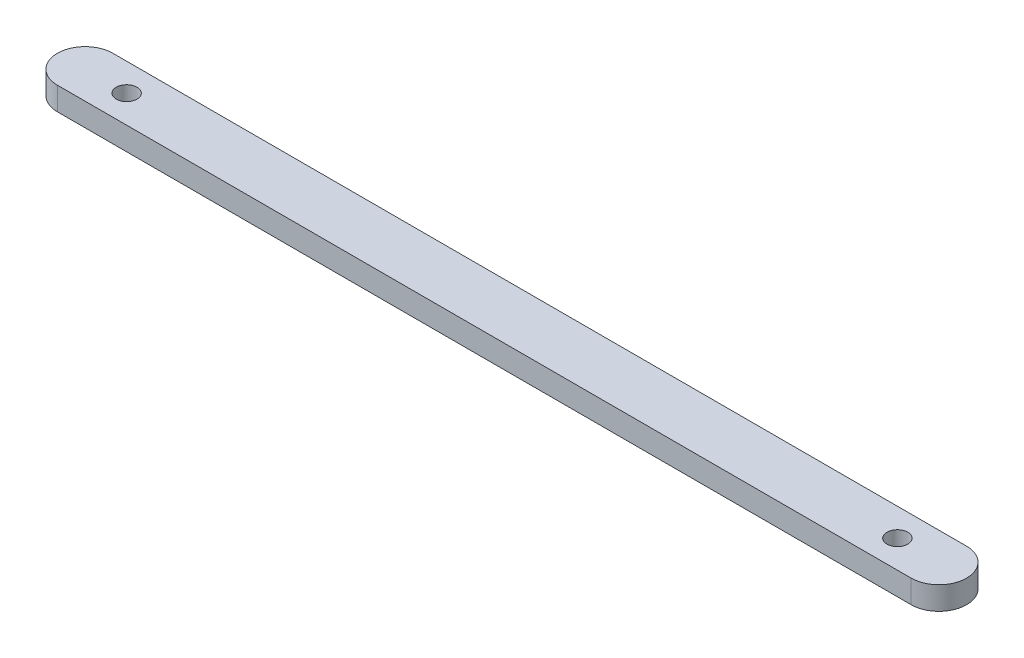
ISO-10303-21;
HEADER;
FILE_DESCRIPTION(('STEP AP214'),'2;1');
FILE_NAME('part.step','',(''),(''),'','','');
FILE_SCHEMA(('AUTOMOTIVE_DESIGN { 1 0 10303 214 1 1 1 1 }'));
ENDSEC;
DATA;
#1=APPLICATION_CONTEXT('core data for automotive mechanical design processes');
#2=APPLICATION_PROTOCOL_DEFINITION('international standard','automotive_design',2000,#1);
#3=PRODUCT_CONTEXT('',#1,'mechanical');
#4=PRODUCT('Part','Part','',(#3));
#5=PRODUCT_RELATED_PRODUCT_CATEGORY('part','',(#4));
#6=PRODUCT_DEFINITION_FORMATION('','',#4);
#7=PRODUCT_DEFINITION_CONTEXT('part definition',#1,'design');
#8=PRODUCT_DEFINITION('design','',#6,#7);
#9=PRODUCT_DEFINITION_SHAPE('','',#8);
#10=(LENGTH_UNIT() NAMED_UNIT(*) SI_UNIT(.MILLI.,.METRE.));
#11=(NAMED_UNIT(*) PLANE_ANGLE_UNIT() SI_UNIT($,.RADIAN.));
#12=(NAMED_UNIT(*) SI_UNIT($,.STERADIAN.) SOLID_ANGLE_UNIT());
#13=UNCERTAINTY_MEASURE_WITH_UNIT(LENGTH_MEASURE(1.E-05),#10,'distance_accuracy_value','');
#14=(GEOMETRIC_REPRESENTATION_CONTEXT(3) GLOBAL_UNCERTAINTY_ASSIGNED_CONTEXT((#13)) GLOBAL_UNIT_ASSIGNED_CONTEXT((#10,
#11,#12)) REPRESENTATION_CONTEXT('',''));
#15=CARTESIAN_POINT('',(0.,0.,0.));
#16=DIRECTION('',(0.,0.,1.));
#17=DIRECTION('',(1.,0.,0.));
#18=AXIS2_PLACEMENT_3D('',#15,#16,#17);
#19=CARTESIAN_POINT('',(-40.3401788719559,5.,0.));
#20=DIRECTION('',(0.,-1.,0.));
#21=DIRECTION('',(0.,0.,-1.));
#22=AXIS2_PLACEMENT_3D('',#19,#20,#21);
#23=CYLINDRICAL_SURFACE('',#22,6.);
#24=CARTESIAN_POINT('',(-40.3401788719559,0.,0.));
#25=DIRECTION('',(0.,1.,0.));
#26=DIRECTION('',(0.,0.,1.));
#27=AXIS2_PLACEMENT_3D('',#24,#25,#26);
#28=CIRCLE('',#27,6.);
#29=CARTESIAN_POINT('',(-40.3401788719559,0.,-6.));
#30=VERTEX_POINT('',#29);
#31=CARTESIAN_POINT('',(-40.3401788719559,0.,6.));
#32=VERTEX_POINT('',#31);
#33=EDGE_CURVE('E110',#30,#32,#28,.T.);
#34=ORIENTED_EDGE('',*,*,#33,.T.);
#35=DIRECTION('',(0.,-1.,0.));
#36=VECTOR('',#35,1.);
#37=CARTESIAN_POINT('',(-40.3401788719559,5.,6.));
#38=LINE('',#37,#36);
#39=CARTESIAN_POINT('',(-40.3401788719559,5.,6.));
#40=VERTEX_POINT('',#39);
#41=EDGE_CURVE('E11',#40,#32,#38,.T.);
#42=ORIENTED_EDGE('',*,*,#41,.F.);
#43=CARTESIAN_POINT('',(-40.3401788719559,5.,0.));
#44=DIRECTION('',(0.,1.,0.));
#45=DIRECTION('',(0.,0.,1.));
#46=AXIS2_PLACEMENT_3D('',#43,#44,#45);
#47=CIRCLE('',#46,6.);
#48=CARTESIAN_POINT('',(-40.3401788719559,5.,-6.));
#49=VERTEX_POINT('',#48);
#50=EDGE_CURVE('E93',#49,#40,#47,.T.);
#51=ORIENTED_EDGE('',*,*,#50,.F.);
#52=DIRECTION('',(0.,-1.,0.));
#53=VECTOR('',#52,1.);
#54=CARTESIAN_POINT('',(-40.3401788719559,5.,-6.));
#55=LINE('',#54,#53);
#56=EDGE_CURVE('E106',#49,#30,#55,.T.);
#57=ORIENTED_EDGE('',*,*,#56,.T.);
#58=EDGE_LOOP('',(#34,#42,#51,#57));
#59=FACE_BOUND('',#58,.T.);
#60=ADVANCED_FACE('F39',(#59),#23,.T.);
#61=CARTESIAN_POINT('',(-40.3401788719559,5.,6.));
#62=DIRECTION('',(0.,0.,-1.));
#63=DIRECTION('',(-1.,0.,0.));
#64=AXIS2_PLACEMENT_3D('',#61,#62,#63);
#65=PLANE('',#64);
#66=DIRECTION('',(1.,0.,0.));
#67=VECTOR('',#66,1.);
#68=CARTESIAN_POINT('',(-40.3401788719559,0.,6.));
#69=LINE('',#68,#67);
#70=CARTESIAN_POINT('',(144.659821128044,0.,6.));
#71=VERTEX_POINT('',#70);
#72=EDGE_CURVE('E98',#32,#71,#69,.T.);
#73=ORIENTED_EDGE('',*,*,#72,.T.);
#74=DIRECTION('',(0.,-1.,0.));
#75=VECTOR('',#74,1.);
#76=CARTESIAN_POINT('',(144.659821128044,5.,6.));
#77=LINE('',#76,#75);
#78=CARTESIAN_POINT('',(144.659821128044,5.,6.));
#79=VERTEX_POINT('',#78);
#80=EDGE_CURVE('E49',#79,#71,#77,.T.);
#81=ORIENTED_EDGE('',*,*,#80,.F.);
#82=DIRECTION('',(1.,0.,0.));
#83=VECTOR('',#82,1.);
#84=CARTESIAN_POINT('',(-40.3401788719559,5.,6.));
#85=LINE('',#84,#83);
#86=EDGE_CURVE('E88',#40,#79,#85,.T.);
#87=ORIENTED_EDGE('',*,*,#86,.F.);
#88=ORIENTED_EDGE('',*,*,#41,.T.);
#89=EDGE_LOOP('',(#73,#81,#87,#88));
#90=FACE_BOUND('',#89,.T.);
#91=ADVANCED_FACE('F97',(#90),#65,.F.);
#92=CARTESIAN_POINT('',(144.659821128044,5.,0.));
#93=DIRECTION('',(0.,-1.,0.));
#94=DIRECTION('',(0.,0.,-1.));
#95=AXIS2_PLACEMENT_3D('',#92,#93,#94);
#96=CYLINDRICAL_SURFACE('',#95,6.);
#97=CARTESIAN_POINT('',(144.659821128044,0.,0.));
#98=DIRECTION('',(0.,1.,0.));
#99=DIRECTION('',(0.,0.,1.));
#100=AXIS2_PLACEMENT_3D('',#97,#98,#99);
#101=CIRCLE('',#100,6.);
#102=CARTESIAN_POINT('',(144.659821128044,0.,-6.));
#103=VERTEX_POINT('',#102);
#104=EDGE_CURVE('E75',#71,#103,#101,.T.);
#105=ORIENTED_EDGE('',*,*,#104,.T.);
#106=DIRECTION('',(0.,-1.,0.));
#107=VECTOR('',#106,1.);
#108=CARTESIAN_POINT('',(144.659821128044,5.,-6.));
#109=LINE('',#108,#107);
#110=CARTESIAN_POINT('',(144.659821128044,5.,-6.));
#111=VERTEX_POINT('',#110);
#112=EDGE_CURVE('E100',#111,#103,#109,.T.);
#113=ORIENTED_EDGE('',*,*,#112,.F.);
#114=CARTESIAN_POINT('',(144.659821128044,5.,0.));
#115=DIRECTION('',(0.,1.,0.));
#116=DIRECTION('',(0.,0.,1.));
#117=AXIS2_PLACEMENT_3D('',#114,#115,#116);
#118=CIRCLE('',#117,6.);
#119=EDGE_CURVE('E91',#79,#111,#118,.T.);
#120=ORIENTED_EDGE('',*,*,#119,.F.);
#121=ORIENTED_EDGE('',*,*,#80,.T.);
#122=EDGE_LOOP('',(#105,#113,#120,#121));
#123=FACE_BOUND('',#122,.T.);
#124=ADVANCED_FACE('F102',(#123),#96,.T.);
#125=CARTESIAN_POINT('',(-40.3401788719559,5.,-6.));
#126=DIRECTION('',(0.,0.,1.));
#127=DIRECTION('',(1.,0.,0.));
#128=AXIS2_PLACEMENT_3D('',#125,#126,#127);
#129=PLANE('',#128);
#130=DIRECTION('',(-1.,0.,0.));
#131=VECTOR('',#130,1.);
#132=CARTESIAN_POINT('',(-40.3401788719559,0.,-6.));
#133=LINE('',#132,#131);
#134=EDGE_CURVE('E81',#103,#30,#133,.T.);
#135=ORIENTED_EDGE('',*,*,#134,.T.);
#136=ORIENTED_EDGE('',*,*,#56,.F.);
#137=DIRECTION('',(-1.,0.,0.));
#138=VECTOR('',#137,1.);
#139=CARTESIAN_POINT('',(-40.3401788719559,5.,-6.));
#140=LINE('',#139,#138);
#141=EDGE_CURVE('E58',#111,#49,#140,.T.);
#142=ORIENTED_EDGE('',*,*,#141,.F.);
#143=ORIENTED_EDGE('',*,*,#112,.T.);
#144=EDGE_LOOP('',(#135,#136,#142,#143));
#145=FACE_BOUND('',#144,.T.);
#146=ADVANCED_FACE('F148',(#145),#129,.F.);
#147=CARTESIAN_POINT('',(-40.3401788719559,5.,0.));
#148=DIRECTION('',(0.,1.,0.));
#149=DIRECTION('',(0.,0.,1.));
#150=AXIS2_PLACEMENT_3D('',#147,#148,#149);
#151=PLANE('',#150);
#152=CARTESIAN_POINT('',(-31.3401788719559,5.,0.));
#153=DIRECTION('',(0.,1.,0.));
#154=DIRECTION('',(0.,0.,1.));
#155=AXIS2_PLACEMENT_3D('',#152,#153,#154);
#156=CIRCLE('',#155,2.25);
#157=CARTESIAN_POINT('',(-31.3401788719559,5.,2.25));
#158=VERTEX_POINT('',#157);
#159=EDGE_CURVE('E126',#158,#158,#156,.T.);
#160=ORIENTED_EDGE('',*,*,#159,.F.);
#161=EDGE_LOOP('',(#160));
#162=FACE_BOUND('',#161,.T.);
#163=CARTESIAN_POINT('',(135.659821128044,5.,0.));
#164=DIRECTION('',(0.,1.,0.));
#165=DIRECTION('',(0.,0.,1.));
#166=AXIS2_PLACEMENT_3D('',#163,#164,#165);
#167=CIRCLE('',#166,2.25000000000001);
#168=CARTESIAN_POINT('',(135.659821128044,5.,2.25000000000001));
#169=VERTEX_POINT('',#168);
#170=EDGE_CURVE('E133',#169,#169,#167,.T.);
#171=ORIENTED_EDGE('',*,*,#170,.F.);
#172=EDGE_LOOP('',(#171));
#173=FACE_BOUND('',#172,.T.);
#174=ORIENTED_EDGE('',*,*,#50,.T.);
#175=ORIENTED_EDGE('',*,*,#86,.T.);
#176=ORIENTED_EDGE('',*,*,#119,.T.);
#177=ORIENTED_EDGE('',*,*,#141,.T.);
#178=EDGE_LOOP('',(#174,#175,#176,#177));
#179=FACE_BOUND('',#178,.T.);
#180=ADVANCED_FACE('F89',(#162,#173,#179),#151,.T.);
#181=CARTESIAN_POINT('',(-40.3401788719559,0.,0.));
#182=DIRECTION('',(0.,1.,0.));
#183=DIRECTION('',(0.,0.,1.));
#184=AXIS2_PLACEMENT_3D('',#181,#182,#183);
#185=PLANE('',#184);
#186=CARTESIAN_POINT('',(-31.3401788719559,0.,0.));
#187=DIRECTION('',(0.,1.,0.));
#188=DIRECTION('',(0.,0.,1.));
#189=AXIS2_PLACEMENT_3D('',#186,#187,#188);
#190=CIRCLE('',#189,2.25);
#191=CARTESIAN_POINT('',(-31.3401788719559,0.,2.25));
#192=VERTEX_POINT('',#191);
#193=EDGE_CURVE('E42',#192,#192,#190,.T.);
#194=ORIENTED_EDGE('',*,*,#193,.T.);
#195=EDGE_LOOP('',(#194));
#196=FACE_BOUND('',#195,.T.);
#197=CARTESIAN_POINT('',(135.659821128044,0.,0.));
#198=DIRECTION('',(0.,1.,0.));
#199=DIRECTION('',(0.,0.,1.));
#200=AXIS2_PLACEMENT_3D('',#197,#198,#199);
#201=CIRCLE('',#200,2.25000000000001);
#202=CARTESIAN_POINT('',(135.659821128044,0.,2.25000000000001));
#203=VERTEX_POINT('',#202);
#204=EDGE_CURVE('E123',#203,#203,#201,.T.);
#205=ORIENTED_EDGE('',*,*,#204,.T.);
#206=EDGE_LOOP('',(#205));
#207=FACE_BOUND('',#206,.T.);
#208=ORIENTED_EDGE('',*,*,#33,.F.);
#209=ORIENTED_EDGE('',*,*,#134,.F.);
#210=ORIENTED_EDGE('',*,*,#104,.F.);
#211=ORIENTED_EDGE('',*,*,#72,.F.);
#212=EDGE_LOOP('',(#208,#209,#210,#211));
#213=FACE_BOUND('',#212,.T.);
#214=ADVANCED_FACE('F147',(#196,#207,#213),#185,.F.);
#215=CARTESIAN_POINT('',(135.659821128044,-3.,0.));
#216=DIRECTION('',(0.,1.,0.));
#217=DIRECTION('',(0.,0.,1.));
#218=AXIS2_PLACEMENT_3D('',#215,#216,#217);
#219=CYLINDRICAL_SURFACE('',#218,2.25000000000001);
#220=ORIENTED_EDGE('',*,*,#170,.T.);
#221=EDGE_LOOP('',(#220));
#222=FACE_BOUND('',#221,.T.);
#223=ORIENTED_EDGE('',*,*,#204,.F.);
#224=EDGE_LOOP('',(#223));
#225=FACE_BOUND('',#224,.T.);
#226=ADVANCED_FACE('F143',(#222,#225),#219,.F.);
#227=CARTESIAN_POINT('',(-31.3401788719559,-3.,0.));
#228=DIRECTION('',(0.,1.,0.));
#229=DIRECTION('',(0.,0.,1.));
#230=AXIS2_PLACEMENT_3D('',#227,#228,#229);
#231=CYLINDRICAL_SURFACE('',#230,2.25);
#232=ORIENTED_EDGE('',*,*,#159,.T.);
#233=EDGE_LOOP('',(#232));
#234=FACE_BOUND('',#233,.T.);
#235=ORIENTED_EDGE('',*,*,#193,.F.);
#236=EDGE_LOOP('',(#235));
#237=FACE_BOUND('',#236,.T.);
#238=ADVANCED_FACE('F195',(#234,#237),#231,.F.);
#239=CLOSED_SHELL('',(#60,#91,#124,#146,#180,#214,#226,#238));
#240=MANIFOLD_SOLID_BREP('B2',#239);
#241=ADVANCED_BREP_SHAPE_REPRESENTATION('',(#18,#240),#14);
#242=SHAPE_DEFINITION_REPRESENTATION(#9,#241);
ENDSEC;
END-ISO-10303-21;
